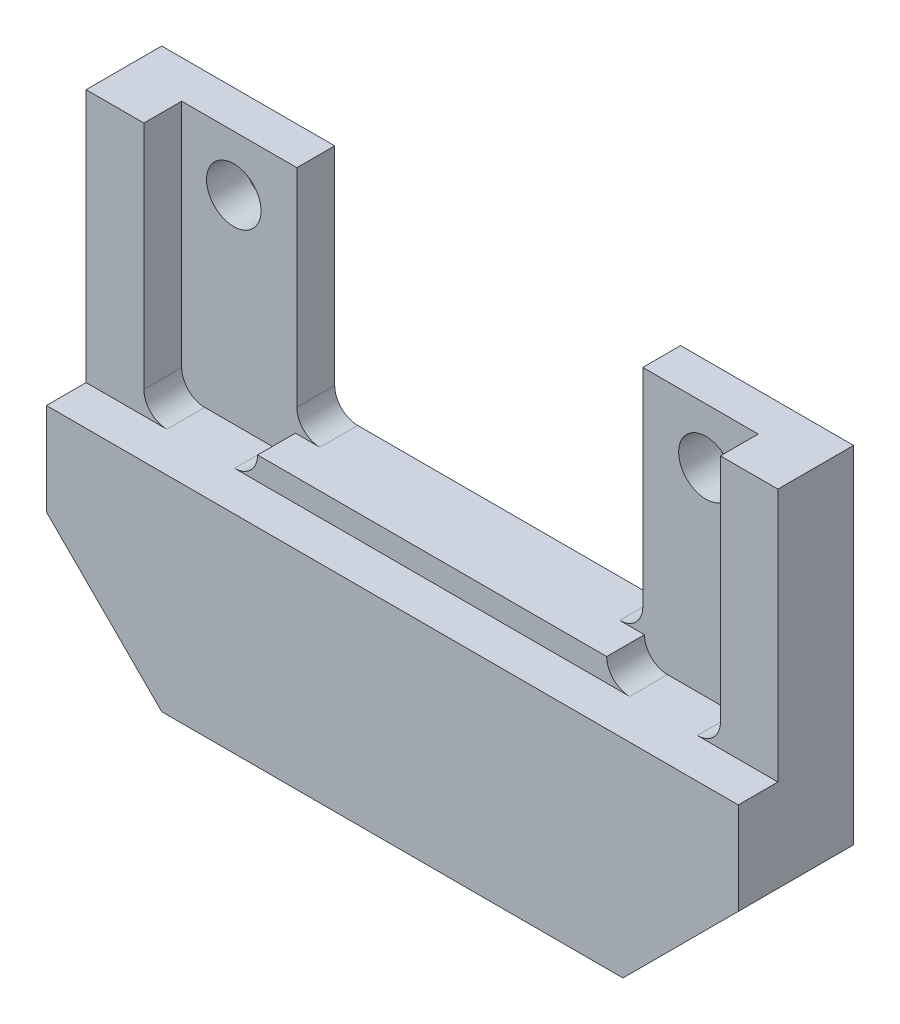
ISO-10303-21;
HEADER;
FILE_DESCRIPTION(('STEP AP214'),'2;1');
FILE_NAME('part.step','',(''),(''),'','','');
FILE_SCHEMA(('AUTOMOTIVE_DESIGN { 1 0 10303 214 1 1 1 1 }'));
ENDSEC;
DATA;
#1=APPLICATION_CONTEXT('core data for automotive mechanical design processes');
#2=APPLICATION_PROTOCOL_DEFINITION('international standard','automotive_design',2000,#1);
#3=PRODUCT_CONTEXT('',#1,'mechanical');
#4=PRODUCT('Part','Part','',(#3));
#5=PRODUCT_RELATED_PRODUCT_CATEGORY('part','',(#4));
#6=PRODUCT_DEFINITION_FORMATION('','',#4);
#7=PRODUCT_DEFINITION_CONTEXT('part definition',#1,'design');
#8=PRODUCT_DEFINITION('design','',#6,#7);
#9=PRODUCT_DEFINITION_SHAPE('','',#8);
#10=(LENGTH_UNIT() NAMED_UNIT(*) SI_UNIT(.MILLI.,.METRE.));
#11=(NAMED_UNIT(*) PLANE_ANGLE_UNIT() SI_UNIT($,.RADIAN.));
#12=(NAMED_UNIT(*) SI_UNIT($,.STERADIAN.) SOLID_ANGLE_UNIT());
#13=UNCERTAINTY_MEASURE_WITH_UNIT(LENGTH_MEASURE(1.E-05),#10,'distance_accuracy_value','');
#14=(GEOMETRIC_REPRESENTATION_CONTEXT(3) GLOBAL_UNCERTAINTY_ASSIGNED_CONTEXT((#13)) GLOBAL_UNIT_ASSIGNED_CONTEXT((#10,
#11,#12)) REPRESENTATION_CONTEXT('',''));
#15=CARTESIAN_POINT('',(0.,0.,0.));
#16=DIRECTION('',(0.,0.,1.));
#17=DIRECTION('',(1.,0.,0.));
#18=AXIS2_PLACEMENT_3D('',#15,#16,#17);
#19=CARTESIAN_POINT('',(0.,0.,-2.1844));
#20=DIRECTION('',(0.,0.,1.));
#21=DIRECTION('',(1.,0.,0.));
#22=AXIS2_PLACEMENT_3D('',#19,#20,#21);
#23=PLANE('',#22);
#24=DIRECTION('',(0.,1.,0.));
#25=VECTOR('',#24,1.);
#26=CARTESIAN_POINT('',(15.8818503138871,0.,-2.1844));
#27=LINE('',#26,#25);
#28=CARTESIAN_POINT('',(15.8818503138871,0.,-2.1844));
#29=VERTEX_POINT('',#28);
#30=CARTESIAN_POINT('',(15.8818503138871,12.7,-2.1844));
#31=VERTEX_POINT('',#30);
#32=EDGE_CURVE('E265',#29,#31,#27,.T.);
#33=ORIENTED_EDGE('',*,*,#32,.F.);
#34=CARTESIAN_POINT('',(14.6118503138871,0.,-2.1844));
#35=DIRECTION('',(0.,0.,1.));
#36=DIRECTION('',(1.,0.,0.));
#37=AXIS2_PLACEMENT_3D('',#34,#35,#36);
#38=CIRCLE('',#37,1.27);
#39=CARTESIAN_POINT('',(14.6118503138871,-1.27,-2.1844));
#40=VERTEX_POINT('',#39);
#41=EDGE_CURVE('E390',#29,#40,#38,.F.);
#42=ORIENTED_EDGE('',*,*,#41,.T.);
#43=DIRECTION('',(1.,0.,0.));
#44=VECTOR('',#43,1.);
#45=CARTESIAN_POINT('',(-19.05,-1.27,-2.1844));
#46=LINE('',#45,#44);
#47=CARTESIAN_POINT('',(19.05,-1.27,-2.1844));
#48=VERTEX_POINT('',#47);
#49=EDGE_CURVE('E292',#40,#48,#46,.T.);
#50=ORIENTED_EDGE('',*,*,#49,.T.);
#51=DIRECTION('',(0.,1.,0.));
#52=VECTOR('',#51,1.);
#53=CARTESIAN_POINT('',(19.05,12.7,-2.1844));
#54=LINE('',#53,#52);
#55=CARTESIAN_POINT('',(19.05,12.7,-2.1844));
#56=VERTEX_POINT('',#55);
#57=EDGE_CURVE('E295',#48,#56,#54,.T.);
#58=ORIENTED_EDGE('',*,*,#57,.T.);
#59=DIRECTION('',(-1.,0.,0.));
#60=VECTOR('',#59,1.);
#61=CARTESIAN_POINT('',(-19.05,12.7,-2.1844));
#62=LINE('',#61,#60);
#63=EDGE_CURVE('E299',#56,#31,#62,.T.);
#64=ORIENTED_EDGE('',*,*,#63,.T.);
#65=EDGE_LOOP('',(#33,#42,#50,#58,#64));
#66=FACE_BOUND('',#65,.T.);
#67=ADVANCED_FACE('F36',(#66),#23,.T.);
#68=CARTESIAN_POINT('',(-10.874808900331,-1.27,-2.1844));
#69=VERTEX_POINT('',#68);
#70=CARTESIAN_POINT('',(10.8885095281051,-1.27,-2.1844));
#71=VERTEX_POINT('',#70);
#72=EDGE_CURVE('E296',#69,#71,#46,.T.);
#73=ORIENTED_EDGE('',*,*,#72,.T.);
#74=CARTESIAN_POINT('',(10.8885095281051,0.,-2.1844));
#75=DIRECTION('',(0.,0.,1.));
#76=DIRECTION('',(1.,0.,0.));
#77=AXIS2_PLACEMENT_3D('',#74,#75,#76);
#78=CIRCLE('',#77,1.27);
#79=CARTESIAN_POINT('',(9.61850952810507,0.,-2.1844));
#80=VERTEX_POINT('',#79);
#81=EDGE_CURVE('E386',#71,#80,#78,.F.);
#82=ORIENTED_EDGE('',*,*,#81,.T.);
#83=DIRECTION('',(1.,0.,0.));
#84=VECTOR('',#83,1.);
#85=CARTESIAN_POINT('',(0.,0.,-2.1844));
#86=LINE('',#85,#84);
#87=CARTESIAN_POINT('',(-9.60480890033097,0.,-2.1844));
#88=VERTEX_POINT('',#87);
#89=EDGE_CURVE('E332',#88,#80,#86,.T.);
#90=ORIENTED_EDGE('',*,*,#89,.F.);
#91=CARTESIAN_POINT('',(-10.874808900331,0.,-2.1844));
#92=DIRECTION('',(0.,0.,1.));
#93=DIRECTION('',(1.,0.,0.));
#94=AXIS2_PLACEMENT_3D('',#91,#92,#93);
#95=CIRCLE('',#94,1.27);
#96=EDGE_CURVE('E383',#88,#69,#95,.F.);
#97=ORIENTED_EDGE('',*,*,#96,.T.);
#98=EDGE_LOOP('',(#73,#82,#90,#97));
#99=FACE_BOUND('',#98,.T.);
#100=ADVANCED_FACE('F477',(#99),#23,.T.);
#101=CARTESIAN_POINT('',(-19.05,12.7,-6.35));
#102=DIRECTION('',(0.,1.,0.));
#103=DIRECTION('',(0.,0.,1.));
#104=AXIS2_PLACEMENT_3D('',#101,#102,#103);
#105=PLANE('',#104);
#106=DIRECTION('',(0.,0.,-1.));
#107=VECTOR('',#106,1.);
#108=CARTESIAN_POINT('',(15.8818503138871,12.7,-4.2672));
#109=LINE('',#108,#107);
#110=CARTESIAN_POINT('',(15.8818503138871,12.7,-4.2672));
#111=VERTEX_POINT('',#110);
#112=EDGE_CURVE('E251',#31,#111,#109,.T.);
#113=ORIENTED_EDGE('',*,*,#112,.F.);
#114=ORIENTED_EDGE('',*,*,#63,.F.);
#115=DIRECTION('',(0.,0.,1.));
#116=VECTOR('',#115,1.);
#117=CARTESIAN_POINT('',(19.05,12.7,-6.35));
#118=LINE('',#117,#116);
#119=CARTESIAN_POINT('',(19.05,12.7,-6.35));
#120=VERTEX_POINT('',#119);
#121=EDGE_CURVE('E322',#120,#56,#118,.T.);
#122=ORIENTED_EDGE('',*,*,#121,.F.);
#123=DIRECTION('',(-1.,0.,0.));
#124=VECTOR('',#123,1.);
#125=CARTESIAN_POINT('',(-19.05,12.7,-6.35));
#126=LINE('',#125,#124);
#127=CARTESIAN_POINT('',(9.52499999999999,12.7,-6.35));
#128=VERTEX_POINT('',#127);
#129=EDGE_CURVE('E314',#120,#128,#126,.T.);
#130=ORIENTED_EDGE('',*,*,#129,.T.);
#131=DIRECTION('',(0.,0.,-1.));
#132=VECTOR('',#131,1.);
#133=CARTESIAN_POINT('',(9.52499999999999,12.7,-6.35));
#134=LINE('',#133,#132);
#135=CARTESIAN_POINT('',(9.52499999999999,12.7,-4.2672));
#136=VERTEX_POINT('',#135);
#137=EDGE_CURVE('E285',#136,#128,#134,.T.);
#138=ORIENTED_EDGE('',*,*,#137,.F.);
#139=DIRECTION('',(-1.,0.,0.));
#140=VECTOR('',#139,1.);
#141=CARTESIAN_POINT('',(15.8818503138871,12.7,-4.2672));
#142=LINE('',#141,#140);
#143=EDGE_CURVE('E259',#111,#136,#142,.T.);
#144=ORIENTED_EDGE('',*,*,#143,.F.);
#145=EDGE_LOOP('',(#113,#114,#122,#130,#138,#144));
#146=FACE_BOUND('',#145,.T.);
#147=ADVANCED_FACE('F467',(#146),#105,.T.);
#148=DIRECTION('',(0.,0.,1.));
#149=VECTOR('',#148,1.);
#150=CARTESIAN_POINT('',(-15.8681496861129,12.7,-4.2672));
#151=LINE('',#150,#149);
#152=CARTESIAN_POINT('',(-15.8681496861129,12.7,-4.2672));
#153=VERTEX_POINT('',#152);
#154=CARTESIAN_POINT('',(-15.8681496861129,12.7,-2.1844));
#155=VERTEX_POINT('',#154);
#156=EDGE_CURVE('E262',#153,#155,#151,.T.);
#157=ORIENTED_EDGE('',*,*,#156,.F.);
#158=CARTESIAN_POINT('',(-9.52500000000001,12.7,-4.2672));
#159=VERTEX_POINT('',#158);
#160=EDGE_CURVE('E258',#159,#153,#142,.T.);
#161=ORIENTED_EDGE('',*,*,#160,.F.);
#162=DIRECTION('',(0.,0.,1.));
#163=VECTOR('',#162,1.);
#164=CARTESIAN_POINT('',(-9.52500000000001,12.7,-6.35));
#165=LINE('',#164,#163);
#166=CARTESIAN_POINT('',(-9.52500000000001,12.7,-6.35));
#167=VERTEX_POINT('',#166);
#168=EDGE_CURVE('E282',#167,#159,#165,.T.);
#169=ORIENTED_EDGE('',*,*,#168,.F.);
#170=CARTESIAN_POINT('',(-19.05,12.7,-6.35));
#171=VERTEX_POINT('',#170);
#172=EDGE_CURVE('E312',#167,#171,#126,.T.);
#173=ORIENTED_EDGE('',*,*,#172,.T.);
#174=DIRECTION('',(0.,0.,1.));
#175=VECTOR('',#174,1.);
#176=CARTESIAN_POINT('',(-19.05,12.7,-6.35));
#177=LINE('',#176,#175);
#178=CARTESIAN_POINT('',(-19.05,12.7,-2.1844));
#179=VERTEX_POINT('',#178);
#180=EDGE_CURVE('E329',#171,#179,#177,.T.);
#181=ORIENTED_EDGE('',*,*,#180,.T.);
#182=EDGE_CURVE('E298',#155,#179,#62,.T.);
#183=ORIENTED_EDGE('',*,*,#182,.F.);
#184=EDGE_LOOP('',(#157,#161,#169,#173,#181,#183));
#185=FACE_BOUND('',#184,.T.);
#186=ADVANCED_FACE('F436',(#185),#105,.T.);
#187=CARTESIAN_POINT('',(19.05,12.7,-6.35));
#188=DIRECTION('',(1.,0.,0.));
#189=DIRECTION('',(0.,1.,0.));
#190=AXIS2_PLACEMENT_3D('',#187,#188,#189);
#191=PLANE('',#190);
#192=DIRECTION('',(0.,1.,0.));
#193=VECTOR('',#192,1.);
#194=CARTESIAN_POINT('',(19.05,12.7,0.));
#195=LINE('',#194,#193);
#196=CARTESIAN_POINT('',(19.05,-6.34999999999997,0.));
#197=VERTEX_POINT('',#196);
#198=CARTESIAN_POINT('',(19.05,-1.27,0.));
#199=VERTEX_POINT('',#198);
#200=EDGE_CURVE('E308',#197,#199,#195,.T.);
#201=ORIENTED_EDGE('',*,*,#200,.F.);
#202=DIRECTION('',(0.,0.,-1.));
#203=VECTOR('',#202,1.);
#204=CARTESIAN_POINT('',(19.05,-6.34999999999997,-6.35));
#205=LINE('',#204,#203);
#206=CARTESIAN_POINT('',(19.05,-6.34999999999997,-6.35));
#207=VERTEX_POINT('',#206);
#208=EDGE_CURVE('E12',#197,#207,#205,.T.);
#209=ORIENTED_EDGE('',*,*,#208,.T.);
#210=DIRECTION('',(0.,1.,0.));
#211=VECTOR('',#210,1.);
#212=CARTESIAN_POINT('',(19.05,12.7,-6.35));
#213=LINE('',#212,#211);
#214=EDGE_CURVE('E310',#207,#120,#213,.T.);
#215=ORIENTED_EDGE('',*,*,#214,.T.);
#216=ORIENTED_EDGE('',*,*,#121,.T.);
#217=ORIENTED_EDGE('',*,*,#57,.F.);
#218=DIRECTION('',(0.,0.,1.));
#219=VECTOR('',#218,1.);
#220=CARTESIAN_POINT('',(19.05,-1.27,-2.1844));
#221=LINE('',#220,#219);
#222=EDGE_CURVE('E305',#48,#199,#221,.T.);
#223=ORIENTED_EDGE('',*,*,#222,.T.);
#224=EDGE_LOOP('',(#201,#209,#215,#216,#217,#223));
#225=FACE_BOUND('',#224,.T.);
#226=ADVANCED_FACE('F426',(#225),#191,.T.);
#227=CARTESIAN_POINT('',(-19.05,-12.7,-6.35));
#228=DIRECTION('',(0.,-1.,0.));
#229=DIRECTION('',(0.,0.,-1.));
#230=AXIS2_PLACEMENT_3D('',#227,#228,#229);
#231=PLANE('',#230);
#232=DIRECTION('',(1.,0.,0.));
#233=VECTOR('',#232,1.);
#234=CARTESIAN_POINT('',(-19.05,-12.7,0.));
#235=LINE('',#234,#233);
#236=CARTESIAN_POINT('',(-12.7,-12.7,0.));
#237=VERTEX_POINT('',#236);
#238=CARTESIAN_POINT('',(12.7,-12.7,0.));
#239=VERTEX_POINT('',#238);
#240=EDGE_CURVE('E313',#237,#239,#235,.T.);
#241=ORIENTED_EDGE('',*,*,#240,.F.);
#242=DIRECTION('',(0.,0.,-1.));
#243=VECTOR('',#242,1.);
#244=CARTESIAN_POINT('',(-12.7,-12.7,-6.35));
#245=LINE('',#244,#243);
#246=CARTESIAN_POINT('',(-12.7,-12.7,-6.35));
#247=VERTEX_POINT('',#246);
#248=EDGE_CURVE('E403',#237,#247,#245,.T.);
#249=ORIENTED_EDGE('',*,*,#248,.T.);
#250=DIRECTION('',(1.,0.,0.));
#251=VECTOR('',#250,1.);
#252=CARTESIAN_POINT('',(-19.05,-12.7,-6.35));
#253=LINE('',#252,#251);
#254=CARTESIAN_POINT('',(12.7,-12.7,-6.35));
#255=VERTEX_POINT('',#254);
#256=EDGE_CURVE('E320',#247,#255,#253,.T.);
#257=ORIENTED_EDGE('',*,*,#256,.T.);
#258=DIRECTION('',(0.,0.,1.));
#259=VECTOR('',#258,1.);
#260=CARTESIAN_POINT('',(12.7,-12.7,-6.35));
#261=LINE('',#260,#259);
#262=EDGE_CURVE('E400',#255,#239,#261,.T.);
#263=ORIENTED_EDGE('',*,*,#262,.T.);
#264=EDGE_LOOP('',(#241,#249,#257,#263));
#265=FACE_BOUND('',#264,.T.);
#266=ADVANCED_FACE('F423',(#265),#231,.T.);
#267=CARTESIAN_POINT('',(-19.05,12.7,-6.35));
#268=DIRECTION('',(-1.,0.,0.));
#269=DIRECTION('',(0.,-1.,0.));
#270=AXIS2_PLACEMENT_3D('',#267,#268,#269);
#271=PLANE('',#270);
#272=DIRECTION('',(0.,-1.,0.));
#273=VECTOR('',#272,1.);
#274=CARTESIAN_POINT('',(-19.05,12.7,-6.35));
#275=LINE('',#274,#273);
#276=CARTESIAN_POINT('',(-19.05,-6.34999999999999,-6.35));
#277=VERTEX_POINT('',#276);
#278=EDGE_CURVE('E317',#171,#277,#275,.T.);
#279=ORIENTED_EDGE('',*,*,#278,.T.);
#280=DIRECTION('',(0.,0.,1.));
#281=VECTOR('',#280,1.);
#282=CARTESIAN_POINT('',(-19.05,-6.34999999999999,-6.35));
#283=LINE('',#282,#281);
#284=CARTESIAN_POINT('',(-19.05,-6.34999999999999,0.));
#285=VERTEX_POINT('',#284);
#286=EDGE_CURVE('E393',#277,#285,#283,.T.);
#287=ORIENTED_EDGE('',*,*,#286,.T.);
#288=DIRECTION('',(0.,-1.,0.));
#289=VECTOR('',#288,1.);
#290=CARTESIAN_POINT('',(-19.05,12.7,0.));
#291=LINE('',#290,#289);
#292=CARTESIAN_POINT('',(-19.05,-1.27,0.));
#293=VERTEX_POINT('',#292);
#294=EDGE_CURVE('E324',#293,#285,#291,.T.);
#295=ORIENTED_EDGE('',*,*,#294,.F.);
#296=DIRECTION('',(0.,0.,1.));
#297=VECTOR('',#296,1.);
#298=CARTESIAN_POINT('',(-19.05,-1.27,-2.1844));
#299=LINE('',#298,#297);
#300=CARTESIAN_POINT('',(-19.05,-1.27,-2.1844));
#301=VERTEX_POINT('',#300);
#302=EDGE_CURVE('E302',#301,#293,#299,.T.);
#303=ORIENTED_EDGE('',*,*,#302,.F.);
#304=DIRECTION('',(0.,-1.,0.));
#305=VECTOR('',#304,1.);
#306=CARTESIAN_POINT('',(-19.05,12.7,-2.1844));
#307=LINE('',#306,#305);
#308=EDGE_CURVE('E289',#179,#301,#307,.T.);
#309=ORIENTED_EDGE('',*,*,#308,.F.);
#310=ORIENTED_EDGE('',*,*,#180,.F.);
#311=EDGE_LOOP('',(#279,#287,#295,#303,#309,#310));
#312=FACE_BOUND('',#311,.T.);
#313=ADVANCED_FACE('F414',(#312),#271,.T.);
#314=CARTESIAN_POINT('',(0.,0.,-6.35));
#315=DIRECTION('',(0.,0.,1.));
#316=DIRECTION('',(1.,0.,0.));
#317=AXIS2_PLACEMENT_3D('',#314,#315,#316);
#318=PLANE('',#317);
#319=CARTESIAN_POINT('',(13.,9.652,-6.35));
#320=DIRECTION('',(0.,0.,1.));
#321=DIRECTION('',(1.,0.,0.));
#322=AXIS2_PLACEMENT_3D('',#319,#320,#321);
#323=CIRCLE('',#322,1.5);
#324=CARTESIAN_POINT('',(14.5,9.652,-6.35));
#325=VERTEX_POINT('',#324);
#326=EDGE_CURVE('E242',#325,#325,#323,.F.);
#327=ORIENTED_EDGE('',*,*,#326,.F.);
#328=EDGE_LOOP('',(#327));
#329=FACE_BOUND('',#328,.T.);
#330=CARTESIAN_POINT('',(-13.,9.652,-6.35));
#331=DIRECTION('',(0.,0.,1.));
#332=DIRECTION('',(1.,0.,0.));
#333=AXIS2_PLACEMENT_3D('',#330,#331,#332);
#334=CIRCLE('',#333,1.5);
#335=CARTESIAN_POINT('',(-11.5,9.652,-6.35));
#336=VERTEX_POINT('',#335);
#337=EDGE_CURVE('E248',#336,#336,#334,.F.);
#338=ORIENTED_EDGE('',*,*,#337,.F.);
#339=EDGE_LOOP('',(#338));
#340=FACE_BOUND('',#339,.T.);
#341=ORIENTED_EDGE('',*,*,#256,.F.);
#342=DIRECTION('',(0.707106781186549,-0.707106781186546,0.));
#343=VECTOR('',#342,1.);
#344=CARTESIAN_POINT('',(-19.05,-6.34999999999999,-6.35));
#345=LINE('',#344,#343);
#346=EDGE_CURVE('E44',#247,#277,#345,.F.);
#347=ORIENTED_EDGE('',*,*,#346,.T.);
#348=ORIENTED_EDGE('',*,*,#278,.F.);
#349=ORIENTED_EDGE('',*,*,#172,.F.);
#350=DIRECTION('',(0.,-1.,0.));
#351=VECTOR('',#350,1.);
#352=CARTESIAN_POINT('',(-9.52500000000001,0.,-6.35));
#353=LINE('',#352,#351);
#354=CARTESIAN_POINT('',(-9.52500000000001,1.27,-6.35));
#355=VERTEX_POINT('',#354);
#356=EDGE_CURVE('E276',#167,#355,#353,.T.);
#357=ORIENTED_EDGE('',*,*,#356,.T.);
#358=CARTESIAN_POINT('',(-8.25500000000001,1.27,-6.35));
#359=DIRECTION('',(0.,0.,1.));
#360=DIRECTION('',(1.,0.,0.));
#361=AXIS2_PLACEMENT_3D('',#358,#359,#360);
#362=CIRCLE('',#361,1.27);
#363=CARTESIAN_POINT('',(-8.25500000000001,0.,-6.35));
#364=VERTEX_POINT('',#363);
#365=EDGE_CURVE('E376',#355,#364,#362,.T.);
#366=ORIENTED_EDGE('',*,*,#365,.T.);
#367=DIRECTION('',(1.,0.,0.));
#368=VECTOR('',#367,1.);
#369=CARTESIAN_POINT('',(-9.52500000000001,0.,-6.35));
#370=LINE('',#369,#368);
#371=CARTESIAN_POINT('',(8.25499999999999,0.,-6.35));
#372=VERTEX_POINT('',#371);
#373=EDGE_CURVE('E279',#364,#372,#370,.T.);
#374=ORIENTED_EDGE('',*,*,#373,.T.);
#375=CARTESIAN_POINT('',(8.25499999999999,1.27,-6.35));
#376=DIRECTION('',(0.,0.,1.));
#377=DIRECTION('',(1.,0.,0.));
#378=AXIS2_PLACEMENT_3D('',#375,#376,#377);
#379=CIRCLE('',#378,1.27);
#380=CARTESIAN_POINT('',(9.52499999999999,1.27,-6.35));
#381=VERTEX_POINT('',#380);
#382=EDGE_CURVE('E381',#372,#381,#379,.T.);
#383=ORIENTED_EDGE('',*,*,#382,.T.);
#384=DIRECTION('',(0.,1.,0.));
#385=VECTOR('',#384,1.);
#386=CARTESIAN_POINT('',(9.52499999999999,0.,-6.35));
#387=LINE('',#386,#385);
#388=EDGE_CURVE('E274',#381,#128,#387,.T.);
#389=ORIENTED_EDGE('',*,*,#388,.T.);
#390=ORIENTED_EDGE('',*,*,#129,.F.);
#391=ORIENTED_EDGE('',*,*,#214,.F.);
#392=DIRECTION('',(0.707106781186546,0.707106781186549,0.));
#393=VECTOR('',#392,1.);
#394=CARTESIAN_POINT('',(12.7,-12.7,-6.35));
#395=LINE('',#394,#393);
#396=EDGE_CURVE('E56',#207,#255,#395,.F.);
#397=ORIENTED_EDGE('',*,*,#396,.T.);
#398=EDGE_LOOP('',(#341,#347,#348,#349,#357,#366,#374,#383,#389,#390,#391,#397));
#399=FACE_BOUND('',#398,.T.);
#400=ADVANCED_FACE('F407',(#329,#340,#399),#318,.F.);
#401=CARTESIAN_POINT('',(0.,0.,0.));
#402=DIRECTION('',(0.,0.,1.));
#403=DIRECTION('',(1.,0.,0.));
#404=AXIS2_PLACEMENT_3D('',#401,#402,#403);
#405=PLANE('',#404);
#406=ORIENTED_EDGE('',*,*,#294,.T.);
#407=DIRECTION('',(-0.707106781186549,0.707106781186546,0.));
#408=VECTOR('',#407,1.);
#409=CARTESIAN_POINT('',(-12.7,-12.7,0.));
#410=LINE('',#409,#408);
#411=EDGE_CURVE('E398',#285,#237,#410,.F.);
#412=ORIENTED_EDGE('',*,*,#411,.T.);
#413=ORIENTED_EDGE('',*,*,#240,.T.);
#414=DIRECTION('',(-0.707106781186546,-0.707106781186549,0.));
#415=VECTOR('',#414,1.);
#416=CARTESIAN_POINT('',(12.7,-12.7,0.));
#417=LINE('',#416,#415);
#418=EDGE_CURVE('E396',#239,#197,#417,.F.);
#419=ORIENTED_EDGE('',*,*,#418,.T.);
#420=ORIENTED_EDGE('',*,*,#200,.T.);
#421=DIRECTION('',(1.,0.,0.));
#422=VECTOR('',#421,1.);
#423=CARTESIAN_POINT('',(-19.05,-1.27,0.));
#424=LINE('',#423,#422);
#425=EDGE_CURVE('E288',#293,#199,#424,.T.);
#426=ORIENTED_EDGE('',*,*,#425,.F.);
#427=EDGE_LOOP('',(#406,#412,#413,#419,#420,#426));
#428=FACE_BOUND('',#427,.T.);
#429=ADVANCED_FACE('F420',(#428),#405,.T.);
#430=CARTESIAN_POINT('',(-19.05,-1.27,-2.1844));
#431=DIRECTION('',(0.,-1.,0.));
#432=DIRECTION('',(0.,0.,-1.));
#433=AXIS2_PLACEMENT_3D('',#430,#431,#432);
#434=PLANE('',#433);
#435=ORIENTED_EDGE('',*,*,#72,.F.);
#436=DIRECTION('',(0.,0.,-1.));
#437=VECTOR('',#436,1.);
#438=CARTESIAN_POINT('',(-10.874808900331,-1.27,-4.2672));
#439=LINE('',#438,#437);
#440=CARTESIAN_POINT('',(-10.874808900331,-1.27,-4.2672));
#441=VERTEX_POINT('',#440);
#442=EDGE_CURVE('E359',#69,#441,#439,.T.);
#443=ORIENTED_EDGE('',*,*,#442,.T.);
#444=DIRECTION('',(-1.,0.,0.));
#445=VECTOR('',#444,1.);
#446=CARTESIAN_POINT('',(-15.8681496861129,-1.27,-4.2672));
#447=LINE('',#446,#445);
#448=CARTESIAN_POINT('',(-14.5981496861129,-1.27,-4.2672));
#449=VERTEX_POINT('',#448);
#450=EDGE_CURVE('E234',#441,#449,#447,.T.);
#451=ORIENTED_EDGE('',*,*,#450,.T.);
#452=DIRECTION('',(0.,0.,1.));
#453=VECTOR('',#452,1.);
#454=CARTESIAN_POINT('',(-14.5981496861129,-1.27,-2.1844));
#455=LINE('',#454,#453);
#456=CARTESIAN_POINT('',(-14.5981496861129,-1.27,-2.1844));
#457=VERTEX_POINT('',#456);
#458=EDGE_CURVE('E353',#449,#457,#455,.T.);
#459=ORIENTED_EDGE('',*,*,#458,.T.);
#460=EDGE_CURVE('E293',#301,#457,#46,.T.);
#461=ORIENTED_EDGE('',*,*,#460,.F.);
#462=ORIENTED_EDGE('',*,*,#302,.T.);
#463=ORIENTED_EDGE('',*,*,#425,.T.);
#464=ORIENTED_EDGE('',*,*,#222,.F.);
#465=ORIENTED_EDGE('',*,*,#49,.F.);
#466=DIRECTION('',(0.,0.,-1.));
#467=VECTOR('',#466,1.);
#468=CARTESIAN_POINT('',(14.6118503138871,-1.27,-4.2672));
#469=LINE('',#468,#467);
#470=CARTESIAN_POINT('',(14.6118503138871,-1.27,-4.2672));
#471=VERTEX_POINT('',#470);
#472=EDGE_CURVE('E350',#40,#471,#469,.T.);
#473=ORIENTED_EDGE('',*,*,#472,.T.);
#474=DIRECTION('',(-1.,0.,0.));
#475=VECTOR('',#474,1.);
#476=CARTESIAN_POINT('',(15.8818503138871,-1.27,-4.2672));
#477=LINE('',#476,#475);
#478=CARTESIAN_POINT('',(10.8885095281051,-1.27,-4.2672));
#479=VERTEX_POINT('',#478);
#480=EDGE_CURVE('E228',#471,#479,#477,.T.);
#481=ORIENTED_EDGE('',*,*,#480,.T.);
#482=DIRECTION('',(0.,0.,1.));
#483=VECTOR('',#482,1.);
#484=CARTESIAN_POINT('',(10.8885095281051,-1.27,-2.1844));
#485=LINE('',#484,#483);
#486=EDGE_CURVE('E356',#479,#71,#485,.T.);
#487=ORIENTED_EDGE('',*,*,#486,.T.);
#488=EDGE_LOOP('',(#435,#443,#451,#459,#461,#462,#463,#464,#465,#473,#481,#487));
#489=FACE_BOUND('',#488,.T.);
#490=ADVANCED_FACE('F430',(#489),#434,.F.);
#491=ORIENTED_EDGE('',*,*,#460,.T.);
#492=CARTESIAN_POINT('',(-14.5981496861129,0.,-2.1844));
#493=DIRECTION('',(0.,0.,1.));
#494=DIRECTION('',(1.,0.,0.));
#495=AXIS2_PLACEMENT_3D('',#492,#493,#494);
#496=CIRCLE('',#495,1.27);
#497=CARTESIAN_POINT('',(-15.8681496861129,0.,-2.1844));
#498=VERTEX_POINT('',#497);
#499=EDGE_CURVE('E388',#457,#498,#496,.F.);
#500=ORIENTED_EDGE('',*,*,#499,.T.);
#501=DIRECTION('',(0.,1.,0.));
#502=VECTOR('',#501,1.);
#503=CARTESIAN_POINT('',(-15.8681496861129,0.,-2.1844));
#504=LINE('',#503,#502);
#505=EDGE_CURVE('E268',#498,#155,#504,.T.);
#506=ORIENTED_EDGE('',*,*,#505,.T.);
#507=ORIENTED_EDGE('',*,*,#182,.T.);
#508=ORIENTED_EDGE('',*,*,#308,.T.);
#509=EDGE_LOOP('',(#491,#500,#506,#507,#508));
#510=FACE_BOUND('',#509,.T.);
#511=ADVANCED_FACE('F499',(#510),#23,.T.);
#512=CARTESIAN_POINT('',(9.52499999999999,0.,-6.35));
#513=DIRECTION('',(1.,0.,0.));
#514=DIRECTION('',(0.,0.,-1.));
#515=AXIS2_PLACEMENT_3D('',#512,#513,#514);
#516=PLANE('',#515);
#517=ORIENTED_EDGE('',*,*,#388,.F.);
#518=DIRECTION('',(0.,0.,1.));
#519=VECTOR('',#518,1.);
#520=CARTESIAN_POINT('',(9.52499999999999,1.27,-4.2672));
#521=LINE('',#520,#519);
#522=CARTESIAN_POINT('',(9.52499999999999,1.27,-4.2672));
#523=VERTEX_POINT('',#522);
#524=EDGE_CURVE('E347',#381,#523,#521,.T.);
#525=ORIENTED_EDGE('',*,*,#524,.T.);
#526=DIRECTION('',(0.,1.,0.));
#527=VECTOR('',#526,1.);
#528=CARTESIAN_POINT('',(9.52499999999999,0.,-4.2672));
#529=LINE('',#528,#527);
#530=EDGE_CURVE('E267',#523,#136,#529,.T.);
#531=ORIENTED_EDGE('',*,*,#530,.T.);
#532=ORIENTED_EDGE('',*,*,#137,.T.);
#533=EDGE_LOOP('',(#517,#525,#531,#532));
#534=FACE_BOUND('',#533,.T.);
#535=ADVANCED_FACE('F458',(#534),#516,.F.);
#536=CARTESIAN_POINT('',(-9.52500000000001,0.,-6.35));
#537=DIRECTION('',(0.,-1.,0.));
#538=DIRECTION('',(0.,0.,-1.));
#539=AXIS2_PLACEMENT_3D('',#536,#537,#538);
#540=PLANE('',#539);
#541=ORIENTED_EDGE('',*,*,#373,.F.);
#542=DIRECTION('',(0.,0.,1.));
#543=VECTOR('',#542,1.);
#544=CARTESIAN_POINT('',(-8.25500000000001,0.,-4.2672));
#545=LINE('',#544,#543);
#546=CARTESIAN_POINT('',(-8.25500000000001,0.,-4.2672));
#547=VERTEX_POINT('',#546);
#548=EDGE_CURVE('E342',#364,#547,#545,.T.);
#549=ORIENTED_EDGE('',*,*,#548,.T.);
#550=DIRECTION('',(-1.,0.,0.));
#551=VECTOR('',#550,1.);
#552=CARTESIAN_POINT('',(15.8818503138871,0.,-4.2672));
#553=LINE('',#552,#551);
#554=CARTESIAN_POINT('',(-9.60480890033097,0.,-4.2672));
#555=VERTEX_POINT('',#554);
#556=EDGE_CURVE('E255',#547,#555,#553,.T.);
#557=ORIENTED_EDGE('',*,*,#556,.T.);
#558=DIRECTION('',(0.,0.,-1.));
#559=VECTOR('',#558,1.);
#560=CARTESIAN_POINT('',(-9.60480890033097,0.,-4.2672));
#561=LINE('',#560,#559);
#562=EDGE_CURVE('E231',#88,#555,#561,.T.);
#563=ORIENTED_EDGE('',*,*,#562,.F.);
#564=ORIENTED_EDGE('',*,*,#89,.T.);
#565=DIRECTION('',(0.,0.,1.));
#566=VECTOR('',#565,1.);
#567=CARTESIAN_POINT('',(9.61850952810507,0.,-4.2672));
#568=LINE('',#567,#566);
#569=CARTESIAN_POINT('',(9.61850952810507,0.,-4.2672));
#570=VERTEX_POINT('',#569);
#571=EDGE_CURVE('E227',#570,#80,#568,.T.);
#572=ORIENTED_EDGE('',*,*,#571,.F.);
#573=CARTESIAN_POINT('',(8.25499999999999,0.,-4.2672));
#574=VERTEX_POINT('',#573);
#575=EDGE_CURVE('E252',#570,#574,#553,.T.);
#576=ORIENTED_EDGE('',*,*,#575,.T.);
#577=DIRECTION('',(0.,0.,1.));
#578=VECTOR('',#577,1.);
#579=CARTESIAN_POINT('',(8.25499999999999,0.,-6.35));
#580=LINE('',#579,#578);
#581=EDGE_CURVE('E340',#574,#372,#580,.F.);
#582=ORIENTED_EDGE('',*,*,#581,.T.);
#583=EDGE_LOOP('',(#541,#549,#557,#563,#564,#572,#576,#582));
#584=FACE_BOUND('',#583,.T.);
#585=ADVANCED_FACE('F449',(#584),#540,.F.);
#586=CARTESIAN_POINT('',(-9.52500000000001,0.,-6.35));
#587=DIRECTION('',(-1.,0.,0.));
#588=DIRECTION('',(0.,0.,1.));
#589=AXIS2_PLACEMENT_3D('',#586,#587,#588);
#590=PLANE('',#589);
#591=DIRECTION('',(0.,-1.,0.));
#592=VECTOR('',#591,1.);
#593=CARTESIAN_POINT('',(-9.52500000000001,0.,-4.2672));
#594=LINE('',#593,#592);
#595=CARTESIAN_POINT('',(-9.52500000000001,1.27,-4.2672));
#596=VERTEX_POINT('',#595);
#597=EDGE_CURVE('E337',#159,#596,#594,.T.);
#598=ORIENTED_EDGE('',*,*,#597,.T.);
#599=DIRECTION('',(0.,0.,1.));
#600=VECTOR('',#599,1.);
#601=CARTESIAN_POINT('',(-9.52500000000001,1.27,-6.35));
#602=LINE('',#601,#600);
#603=EDGE_CURVE('E345',#596,#355,#602,.F.);
#604=ORIENTED_EDGE('',*,*,#603,.T.);
#605=ORIENTED_EDGE('',*,*,#356,.F.);
#606=ORIENTED_EDGE('',*,*,#168,.T.);
#607=EDGE_LOOP('',(#598,#604,#605,#606));
#608=FACE_BOUND('',#607,.T.);
#609=ADVANCED_FACE('F503',(#608),#590,.F.);
#610=CARTESIAN_POINT('',(15.8818503138871,0.,-4.2672));
#611=DIRECTION('',(0.,0.,-1.));
#612=DIRECTION('',(-1.,0.,0.));
#613=AXIS2_PLACEMENT_3D('',#610,#611,#612);
#614=PLANE('',#613);
#615=CARTESIAN_POINT('',(-13.,9.652,-4.2672));
#616=DIRECTION('',(0.,0.,-1.));
#617=DIRECTION('',(-1.,0.,0.));
#618=AXIS2_PLACEMENT_3D('',#615,#616,#617);
#619=CIRCLE('',#618,1.5);
#620=CARTESIAN_POINT('',(-14.5,9.652,-4.2672));
#621=VERTEX_POINT('',#620);
#622=EDGE_CURVE('E245',#621,#621,#619,.F.);
#623=ORIENTED_EDGE('',*,*,#622,.F.);
#624=EDGE_LOOP('',(#623));
#625=FACE_BOUND('',#624,.T.);
#626=ORIENTED_EDGE('',*,*,#450,.F.);
#627=CARTESIAN_POINT('',(-10.874808900331,0.,-4.2672));
#628=DIRECTION('',(0.,0.,-1.));
#629=DIRECTION('',(-1.,0.,0.));
#630=AXIS2_PLACEMENT_3D('',#627,#628,#629);
#631=CIRCLE('',#630,1.27);
#632=EDGE_CURVE('E364',#441,#555,#631,.F.);
#633=ORIENTED_EDGE('',*,*,#632,.T.);
#634=ORIENTED_EDGE('',*,*,#556,.F.);
#635=CARTESIAN_POINT('',(-8.25500000000001,1.27,-4.2672));
#636=DIRECTION('',(0.,0.,-1.));
#637=DIRECTION('',(-1.,0.,0.));
#638=AXIS2_PLACEMENT_3D('',#635,#636,#637);
#639=CIRCLE('',#638,1.27);
#640=EDGE_CURVE('E374',#547,#596,#639,.T.);
#641=ORIENTED_EDGE('',*,*,#640,.T.);
#642=ORIENTED_EDGE('',*,*,#597,.F.);
#643=ORIENTED_EDGE('',*,*,#160,.T.);
#644=DIRECTION('',(0.,1.,0.));
#645=VECTOR('',#644,1.);
#646=CARTESIAN_POINT('',(-15.8681496861129,0.,-4.2672));
#647=LINE('',#646,#645);
#648=CARTESIAN_POINT('',(-15.8681496861129,0.,-4.2672));
#649=VERTEX_POINT('',#648);
#650=EDGE_CURVE('E270',#649,#153,#647,.T.);
#651=ORIENTED_EDGE('',*,*,#650,.F.);
#652=CARTESIAN_POINT('',(-14.5981496861129,0.,-4.2672));
#653=DIRECTION('',(0.,0.,-1.));
#654=DIRECTION('',(-1.,0.,0.));
#655=AXIS2_PLACEMENT_3D('',#652,#653,#654);
#656=CIRCLE('',#655,1.27);
#657=EDGE_CURVE('E362',#649,#449,#656,.F.);
#658=ORIENTED_EDGE('',*,*,#657,.T.);
#659=EDGE_LOOP('',(#626,#633,#634,#641,#642,#643,#651,#658));
#660=FACE_BOUND('',#659,.T.);
#661=ADVANCED_FACE('F491',(#625,#660),#614,.F.);
#662=CARTESIAN_POINT('',(-15.8681496861129,0.,-4.2672));
#663=DIRECTION('',(-1.,0.,0.));
#664=DIRECTION('',(0.,0.,1.));
#665=AXIS2_PLACEMENT_3D('',#662,#663,#664);
#666=PLANE('',#665);
#667=ORIENTED_EDGE('',*,*,#505,.F.);
#668=DIRECTION('',(0.,0.,1.));
#669=VECTOR('',#668,1.);
#670=CARTESIAN_POINT('',(-15.8681496861129,0.,-4.2672));
#671=LINE('',#670,#669);
#672=EDGE_CURVE('E370',#498,#649,#671,.F.);
#673=ORIENTED_EDGE('',*,*,#672,.T.);
#674=ORIENTED_EDGE('',*,*,#650,.T.);
#675=ORIENTED_EDGE('',*,*,#156,.T.);
#676=EDGE_LOOP('',(#667,#673,#674,#675));
#677=FACE_BOUND('',#676,.T.);
#678=ADVANCED_FACE('F502',(#677),#666,.F.);
#679=CARTESIAN_POINT('',(13.,9.652,-4.2672));
#680=DIRECTION('',(0.,0.,-1.));
#681=DIRECTION('',(-1.,0.,0.));
#682=AXIS2_PLACEMENT_3D('',#679,#680,#681);
#683=CIRCLE('',#682,1.5);
#684=CARTESIAN_POINT('',(11.5,9.652,-4.2672));
#685=VERTEX_POINT('',#684);
#686=EDGE_CURVE('E237',#685,#685,#683,.F.);
#687=ORIENTED_EDGE('',*,*,#686,.F.);
#688=EDGE_LOOP('',(#687));
#689=FACE_BOUND('',#688,.T.);
#690=ORIENTED_EDGE('',*,*,#575,.F.);
#691=CARTESIAN_POINT('',(10.8885095281051,0.,-4.2672));
#692=DIRECTION('',(0.,0.,-1.));
#693=DIRECTION('',(-1.,0.,0.));
#694=AXIS2_PLACEMENT_3D('',#691,#692,#693);
#695=CIRCLE('',#694,1.27);
#696=EDGE_CURVE('E368',#570,#479,#695,.F.);
#697=ORIENTED_EDGE('',*,*,#696,.T.);
#698=ORIENTED_EDGE('',*,*,#480,.F.);
#699=CARTESIAN_POINT('',(14.6118503138871,0.,-4.2672));
#700=DIRECTION('',(0.,0.,-1.));
#701=DIRECTION('',(-1.,0.,0.));
#702=AXIS2_PLACEMENT_3D('',#699,#700,#701);
#703=CIRCLE('',#702,1.27);
#704=CARTESIAN_POINT('',(15.8818503138871,0.,-4.2672));
#705=VERTEX_POINT('',#704);
#706=EDGE_CURVE('E366',#471,#705,#703,.F.);
#707=ORIENTED_EDGE('',*,*,#706,.T.);
#708=DIRECTION('',(0.,1.,0.));
#709=VECTOR('',#708,1.);
#710=CARTESIAN_POINT('',(15.8818503138871,0.,-4.2672));
#711=LINE('',#710,#709);
#712=EDGE_CURVE('E254',#705,#111,#711,.T.);
#713=ORIENTED_EDGE('',*,*,#712,.T.);
#714=ORIENTED_EDGE('',*,*,#143,.T.);
#715=ORIENTED_EDGE('',*,*,#530,.F.);
#716=CARTESIAN_POINT('',(8.25499999999999,1.27,-4.2672));
#717=DIRECTION('',(0.,0.,-1.));
#718=DIRECTION('',(-1.,0.,0.));
#719=AXIS2_PLACEMENT_3D('',#716,#717,#718);
#720=CIRCLE('',#719,1.27);
#721=EDGE_CURVE('E378',#523,#574,#720,.T.);
#722=ORIENTED_EDGE('',*,*,#721,.T.);
#723=EDGE_LOOP('',(#690,#697,#698,#707,#713,#714,#715,#722));
#724=FACE_BOUND('',#723,.T.);
#725=ADVANCED_FACE('F461',(#689,#724),#614,.F.);
#726=CARTESIAN_POINT('',(15.8818503138871,0.,-4.2672));
#727=DIRECTION('',(1.,0.,0.));
#728=DIRECTION('',(0.,0.,-1.));
#729=AXIS2_PLACEMENT_3D('',#726,#727,#728);
#730=PLANE('',#729);
#731=ORIENTED_EDGE('',*,*,#712,.F.);
#732=DIRECTION('',(0.,0.,-1.));
#733=VECTOR('',#732,1.);
#734=CARTESIAN_POINT('',(15.8818503138871,0.,-2.1844));
#735=LINE('',#734,#733);
#736=EDGE_CURVE('E372',#705,#29,#735,.F.);
#737=ORIENTED_EDGE('',*,*,#736,.T.);
#738=ORIENTED_EDGE('',*,*,#32,.T.);
#739=ORIENTED_EDGE('',*,*,#112,.T.);
#740=EDGE_LOOP('',(#731,#737,#738,#739));
#741=FACE_BOUND('',#740,.T.);
#742=ADVANCED_FACE('F585',(#741),#730,.F.);
#743=CARTESIAN_POINT('',(-13.,9.652,-6.351));
#744=DIRECTION('',(0.,0.,1.));
#745=DIRECTION('',(1.,0.,0.));
#746=AXIS2_PLACEMENT_3D('',#743,#744,#745);
#747=CYLINDRICAL_SURFACE('',#746,1.5);
#748=ORIENTED_EDGE('',*,*,#622,.T.);
#749=EDGE_LOOP('',(#748));
#750=FACE_BOUND('',#749,.T.);
#751=ORIENTED_EDGE('',*,*,#337,.T.);
#752=EDGE_LOOP('',(#751));
#753=FACE_BOUND('',#752,.T.);
#754=ADVANCED_FACE('F581',(#750,#753),#747,.F.);
#755=CARTESIAN_POINT('',(13.,9.652,-6.351));
#756=DIRECTION('',(0.,0.,1.));
#757=DIRECTION('',(1.,0.,0.));
#758=AXIS2_PLACEMENT_3D('',#755,#756,#757);
#759=CYLINDRICAL_SURFACE('',#758,1.5);
#760=ORIENTED_EDGE('',*,*,#686,.T.);
#761=EDGE_LOOP('',(#760));
#762=FACE_BOUND('',#761,.T.);
#763=ORIENTED_EDGE('',*,*,#326,.T.);
#764=EDGE_LOOP('',(#763));
#765=FACE_BOUND('',#764,.T.);
#766=ADVANCED_FACE('F543',(#762,#765),#759,.F.);
#767=CARTESIAN_POINT('',(-8.25500000000001,1.27,-6.35));
#768=DIRECTION('',(0.,0.,-1.));
#769=DIRECTION('',(-1.,0.,0.));
#770=AXIS2_PLACEMENT_3D('',#767,#768,#769);
#771=CYLINDRICAL_SURFACE('',#770,1.27);
#772=ORIENTED_EDGE('',*,*,#365,.F.);
#773=ORIENTED_EDGE('',*,*,#603,.F.);
#774=ORIENTED_EDGE('',*,*,#640,.F.);
#775=ORIENTED_EDGE('',*,*,#548,.F.);
#776=EDGE_LOOP('',(#772,#773,#774,#775));
#777=FACE_BOUND('',#776,.T.);
#778=ADVANCED_FACE('F445',(#777),#771,.F.);
#779=CARTESIAN_POINT('',(8.25499999999999,1.27,-6.35));
#780=DIRECTION('',(0.,0.,-1.));
#781=DIRECTION('',(-1.,0.,0.));
#782=AXIS2_PLACEMENT_3D('',#779,#780,#781);
#783=CYLINDRICAL_SURFACE('',#782,1.27);
#784=ORIENTED_EDGE('',*,*,#382,.F.);
#785=ORIENTED_EDGE('',*,*,#581,.F.);
#786=ORIENTED_EDGE('',*,*,#721,.F.);
#787=ORIENTED_EDGE('',*,*,#524,.F.);
#788=EDGE_LOOP('',(#784,#785,#786,#787));
#789=FACE_BOUND('',#788,.T.);
#790=ADVANCED_FACE('F455',(#789),#783,.F.);
#791=CARTESIAN_POINT('',(-10.874808900331,0.,-2.1844));
#792=DIRECTION('',(0.,0.,1.));
#793=DIRECTION('',(1.,0.,0.));
#794=AXIS2_PLACEMENT_3D('',#791,#792,#793);
#795=CYLINDRICAL_SURFACE('',#794,1.27);
#796=ORIENTED_EDGE('',*,*,#96,.F.);
#797=ORIENTED_EDGE('',*,*,#562,.T.);
#798=ORIENTED_EDGE('',*,*,#632,.F.);
#799=ORIENTED_EDGE('',*,*,#442,.F.);
#800=EDGE_LOOP('',(#796,#797,#798,#799));
#801=FACE_BOUND('',#800,.T.);
#802=ADVANCED_FACE('F487',(#801),#795,.F.);
#803=CARTESIAN_POINT('',(10.8885095281051,0.,-2.1844));
#804=DIRECTION('',(0.,0.,-1.));
#805=DIRECTION('',(-1.,0.,0.));
#806=AXIS2_PLACEMENT_3D('',#803,#804,#805);
#807=CYLINDRICAL_SURFACE('',#806,1.27);
#808=ORIENTED_EDGE('',*,*,#696,.F.);
#809=ORIENTED_EDGE('',*,*,#571,.T.);
#810=ORIENTED_EDGE('',*,*,#81,.F.);
#811=ORIENTED_EDGE('',*,*,#486,.F.);
#812=EDGE_LOOP('',(#808,#809,#810,#811));
#813=FACE_BOUND('',#812,.T.);
#814=ADVANCED_FACE('F484',(#813),#807,.F.);
#815=CARTESIAN_POINT('',(-14.5981496861129,0.,-2.1844));
#816=DIRECTION('',(0.,0.,-1.));
#817=DIRECTION('',(-1.,0.,0.));
#818=AXIS2_PLACEMENT_3D('',#815,#816,#817);
#819=CYLINDRICAL_SURFACE('',#818,1.27);
#820=ORIENTED_EDGE('',*,*,#657,.F.);
#821=ORIENTED_EDGE('',*,*,#672,.F.);
#822=ORIENTED_EDGE('',*,*,#499,.F.);
#823=ORIENTED_EDGE('',*,*,#458,.F.);
#824=EDGE_LOOP('',(#820,#821,#822,#823));
#825=FACE_BOUND('',#824,.T.);
#826=ADVANCED_FACE('F497',(#825),#819,.F.);
#827=CARTESIAN_POINT('',(14.6118503138871,0.,-2.1844));
#828=DIRECTION('',(0.,0.,1.));
#829=DIRECTION('',(1.,0.,0.));
#830=AXIS2_PLACEMENT_3D('',#827,#828,#829);
#831=CYLINDRICAL_SURFACE('',#830,1.27);
#832=ORIENTED_EDGE('',*,*,#41,.F.);
#833=ORIENTED_EDGE('',*,*,#736,.F.);
#834=ORIENTED_EDGE('',*,*,#706,.F.);
#835=ORIENTED_EDGE('',*,*,#472,.F.);
#836=EDGE_LOOP('',(#832,#833,#834,#835));
#837=FACE_BOUND('',#836,.T.);
#838=ADVANCED_FACE('F552',(#837),#831,.F.);
#839=CARTESIAN_POINT('',(-19.05,-6.34999999999999,-6.35));
#840=DIRECTION('',(0.707106781186546,0.707106781186549,0.));
#841=DIRECTION('',(0.,0.,1.));
#842=AXIS2_PLACEMENT_3D('',#839,#840,#841);
#843=PLANE('',#842);
#844=CARTESIAN_POINT('',(-15.875,-9.52499999999999,-3.175));
#845=DIRECTION('',(-0.707106781186546,-0.707106781186549,0.));
#846=DIRECTION('',(0.707106781186549,-0.707106781186546,0.));
#847=AXIS2_PLACEMENT_3D('',#844,#845,#846);
#848=CIRCLE('',#847,2.54);
#849=CARTESIAN_POINT('',(-14.0789487757862,-11.3210512242138,-3.175));
#850=VERTEX_POINT('',#849);
#851=EDGE_CURVE('E211',#850,#850,#848,.T.);
#852=ORIENTED_EDGE('',*,*,#851,.F.);
#853=EDGE_LOOP('',(#852));
#854=FACE_BOUND('',#853,.T.);
#855=ORIENTED_EDGE('',*,*,#346,.F.);
#856=ORIENTED_EDGE('',*,*,#248,.F.);
#857=ORIENTED_EDGE('',*,*,#411,.F.);
#858=ORIENTED_EDGE('',*,*,#286,.F.);
#859=EDGE_LOOP('',(#855,#856,#857,#858));
#860=FACE_BOUND('',#859,.T.);
#861=ADVANCED_FACE('F417',(#854,#860),#843,.F.);
#862=CARTESIAN_POINT('',(12.7,-12.7,-6.35));
#863=DIRECTION('',(-0.707106781186549,0.707106781186546,0.));
#864=DIRECTION('',(0.,0.,1.));
#865=AXIS2_PLACEMENT_3D('',#862,#863,#864);
#866=PLANE('',#865);
#867=CARTESIAN_POINT('',(15.875,-9.52499999999999,-3.175));
#868=DIRECTION('',(0.707106781186549,-0.707106781186546,0.));
#869=DIRECTION('',(0.707106781186546,0.707106781186549,0.));
#870=AXIS2_PLACEMENT_3D('',#867,#868,#869);
#871=CIRCLE('',#870,2.54);
#872=CARTESIAN_POINT('',(17.6710512242138,-7.72894877578615,-3.175));
#873=VERTEX_POINT('',#872);
#874=EDGE_CURVE('E218',#873,#873,#871,.T.);
#875=ORIENTED_EDGE('',*,*,#874,.F.);
#876=EDGE_LOOP('',(#875));
#877=FACE_BOUND('',#876,.T.);
#878=ORIENTED_EDGE('',*,*,#396,.F.);
#879=ORIENTED_EDGE('',*,*,#208,.F.);
#880=ORIENTED_EDGE('',*,*,#418,.F.);
#881=ORIENTED_EDGE('',*,*,#262,.F.);
#882=EDGE_LOOP('',(#878,#879,#880,#881));
#883=FACE_BOUND('',#882,.T.);
#884=ADVANCED_FACE('F38',(#877,#883),#866,.F.);
#885=CARTESIAN_POINT('',(-11.3848719394654,-5.03487193946541,-3.175));
#886=DIRECTION('',(-0.707106781186546,-0.707106781186549,0.));
#887=DIRECTION('',(0.707106781186549,-0.707106781186546,0.));
#888=AXIS2_PLACEMENT_3D('',#885,#886,#887);
#889=CONICAL_SURFACE('',#888,1.7272,1.02974425867665);
#890=CARTESIAN_POINT('',(-10.6510319532027,-4.3010319532027,-3.175));
#891=VERTEX_POINT('',#890);
#892=VERTEX_LOOP('',#891);
#893=FACE_BOUND('',#892,.T.);
#894=CARTESIAN_POINT('',(-11.3848719394654,-5.03487193946541,-3.175));
#895=DIRECTION('',(-0.707106781186546,-0.707106781186549,0.));
#896=DIRECTION('',(0.707106781186549,-0.707106781186546,0.));
#897=AXIS2_PLACEMENT_3D('',#894,#895,#896);
#898=CIRCLE('',#897,1.7272);
#899=CARTESIAN_POINT('',(-10.163557107,-6.25618677193081,-3.175));
#900=VERTEX_POINT('',#899);
#901=EDGE_CURVE('E224',#900,#900,#898,.T.);
#902=ORIENTED_EDGE('',*,*,#901,.T.);
#903=EDGE_LOOP('',(#902));
#904=FACE_BOUND('',#903,.T.);
#905=ADVANCED_FACE('F560',(#893,#904),#889,.F.);
#906=CARTESIAN_POINT('',(-15.875,-9.52499999999999,-3.175));
#907=DIRECTION('',(-0.707106781186546,-0.707106781186549,0.));
#908=DIRECTION('',(0.707106781186549,-0.707106781186546,0.));
#909=AXIS2_PLACEMENT_3D('',#906,#907,#908);
#910=CYLINDRICAL_SURFACE('',#909,1.7272);
#911=ORIENTED_EDGE('',*,*,#901,.F.);
#912=EDGE_LOOP('',(#911));
#913=FACE_BOUND('',#912,.T.);
#914=CARTESIAN_POINT('',(-15.3002636082516,-8.95026360825157,-3.175));
#915=DIRECTION('',(-0.707106781186546,-0.707106781186549,0.));
#916=DIRECTION('',(0.707106781186549,-0.707106781186546,0.));
#917=AXIS2_PLACEMENT_3D('',#914,#915,#916);
#918=CIRCLE('',#917,1.7272);
#919=CARTESIAN_POINT('',(-14.0789487757862,-10.171578440717,-3.175));
#920=VERTEX_POINT('',#919);
#921=EDGE_CURVE('E215',#920,#920,#918,.T.);
#922=ORIENTED_EDGE('',*,*,#921,.T.);
#923=EDGE_LOOP('',(#922));
#924=FACE_BOUND('',#923,.T.);
#925=ADVANCED_FACE('F565',(#913,#924),#910,.F.);
#926=CARTESIAN_POINT('',(-15.875,-9.52499999999999,-3.175));
#927=DIRECTION('',(-0.707106781186546,-0.707106781186549,0.));
#928=DIRECTION('',(0.707106781186549,-0.707106781186546,0.));
#929=AXIS2_PLACEMENT_3D('',#926,#927,#928);
#930=CONICAL_SURFACE('',#929,2.54,0.785398163397449);
#931=ORIENTED_EDGE('',*,*,#921,.F.);
#932=EDGE_LOOP('',(#931));
#933=FACE_BOUND('',#932,.T.);
#934=ORIENTED_EDGE('',*,*,#851,.T.);
#935=EDGE_LOOP('',(#934));
#936=FACE_BOUND('',#935,.T.);
#937=ADVANCED_FACE('F205',(#933,#936),#930,.F.);
#938=CARTESIAN_POINT('',(11.3848719394654,-5.03487193946542,-3.175));
#939=DIRECTION('',(0.707106781186549,-0.707106781186546,0.));
#940=DIRECTION('',(0.707106781186546,0.707106781186549,0.));
#941=AXIS2_PLACEMENT_3D('',#938,#939,#940);
#942=CONICAL_SURFACE('',#941,1.7272,1.02974425867665);
#943=CARTESIAN_POINT('',(10.6510319532027,-4.30103195320272,-3.175));
#944=VERTEX_POINT('',#943);
#945=VERTEX_LOOP('',#944);
#946=FACE_BOUND('',#945,.T.);
#947=CARTESIAN_POINT('',(11.3848719394654,-5.03487193946542,-3.175));
#948=DIRECTION('',(0.707106781186549,-0.707106781186546,0.));
#949=DIRECTION('',(0.707106781186546,0.707106781186549,0.));
#950=AXIS2_PLACEMENT_3D('',#947,#948,#949);
#951=CIRCLE('',#950,1.7272);
#952=CARTESIAN_POINT('',(12.6061867719308,-3.81355710700001,-3.175));
#953=VERTEX_POINT('',#952);
#954=EDGE_CURVE('E209',#953,#953,#951,.T.);
#955=ORIENTED_EDGE('',*,*,#954,.T.);
#956=EDGE_LOOP('',(#955));
#957=FACE_BOUND('',#956,.T.);
#958=ADVANCED_FACE('F201',(#946,#957),#942,.F.);
#959=CARTESIAN_POINT('',(15.875,-9.52499999999999,-3.175));
#960=DIRECTION('',(0.707106781186549,-0.707106781186546,0.));
#961=DIRECTION('',(0.707106781186546,0.707106781186549,0.));
#962=AXIS2_PLACEMENT_3D('',#959,#960,#961);
#963=CYLINDRICAL_SURFACE('',#962,1.72719999999999);
#964=ORIENTED_EDGE('',*,*,#954,.F.);
#965=EDGE_LOOP('',(#964));
#966=FACE_BOUND('',#965,.T.);
#967=CARTESIAN_POINT('',(15.3002636082516,-8.95026360825156,-3.175));
#968=DIRECTION('',(0.707106781186549,-0.707106781186546,0.));
#969=DIRECTION('',(0.707106781186546,0.707106781186549,0.));
#970=AXIS2_PLACEMENT_3D('',#967,#968,#969);
#971=CIRCLE('',#970,1.72719999999999);
#972=CARTESIAN_POINT('',(16.521578440717,-7.72894877578616,-3.175));
#973=VERTEX_POINT('',#972);
#974=EDGE_CURVE('E212',#973,#973,#971,.T.);
#975=ORIENTED_EDGE('',*,*,#974,.T.);
#976=EDGE_LOOP('',(#975));
#977=FACE_BOUND('',#976,.T.);
#978=ADVANCED_FACE('F204',(#966,#977),#963,.F.);
#979=CARTESIAN_POINT('',(15.875,-9.52499999999999,-3.175));
#980=DIRECTION('',(0.707106781186549,-0.707106781186546,0.));
#981=DIRECTION('',(0.707106781186546,0.707106781186549,0.));
#982=AXIS2_PLACEMENT_3D('',#979,#980,#981);
#983=CONICAL_SURFACE('',#982,2.54,0.785398163397454);
#984=ORIENTED_EDGE('',*,*,#974,.F.);
#985=EDGE_LOOP('',(#984));
#986=FACE_BOUND('',#985,.T.);
#987=ORIENTED_EDGE('',*,*,#874,.T.);
#988=EDGE_LOOP('',(#987));
#989=FACE_BOUND('',#988,.T.);
#990=ADVANCED_FACE('F740',(#986,#989),#983,.F.);
#991=CLOSED_SHELL('',(#67,#100,#147,#186,#226,#266,#313,#400,#429,#490,#511,#535,#585,#609,#661,
#678,#725,#742,#754,#766,#778,#790,#802,#814,#826,#838,#861,#884,#905,#925,#937,#958,#978,#990));
#992=MANIFOLD_SOLID_BREP('B2',#991);
#993=ADVANCED_BREP_SHAPE_REPRESENTATION('',(#18,#992),#14);
#994=SHAPE_DEFINITION_REPRESENTATION(#9,#993);
ENDSEC;
END-ISO-10303-21;
